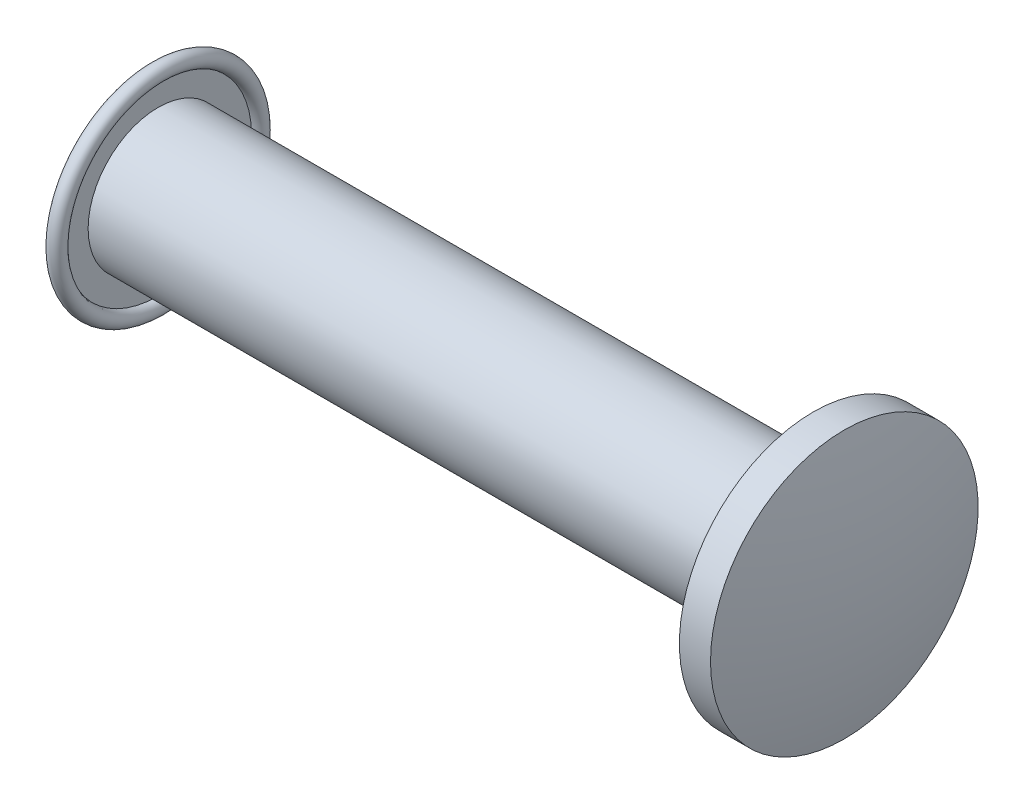
ISO-10303-21;
HEADER;
FILE_DESCRIPTION(('STEP AP214'),'2;1');
FILE_NAME('part.step','',(''),(''),'','','');
FILE_SCHEMA(('AUTOMOTIVE_DESIGN { 1 0 10303 214 1 1 1 1 }'));
ENDSEC;
DATA;
#1=APPLICATION_CONTEXT('core data for automotive mechanical design processes');
#2=APPLICATION_PROTOCOL_DEFINITION('international standard','automotive_design',2000,#1);
#3=PRODUCT_CONTEXT('',#1,'mechanical');
#4=PRODUCT('Part','Part','',(#3));
#5=PRODUCT_RELATED_PRODUCT_CATEGORY('part','',(#4));
#6=PRODUCT_DEFINITION_FORMATION('','',#4);
#7=PRODUCT_DEFINITION_CONTEXT('part definition',#1,'design');
#8=PRODUCT_DEFINITION('design','',#6,#7);
#9=PRODUCT_DEFINITION_SHAPE('','',#8);
#10=(LENGTH_UNIT() NAMED_UNIT(*) SI_UNIT(.MILLI.,.METRE.));
#11=(NAMED_UNIT(*) PLANE_ANGLE_UNIT() SI_UNIT($,.RADIAN.));
#12=(NAMED_UNIT(*) SI_UNIT($,.STERADIAN.) SOLID_ANGLE_UNIT());
#13=UNCERTAINTY_MEASURE_WITH_UNIT(LENGTH_MEASURE(1.E-05),#10,'distance_accuracy_value','');
#14=(GEOMETRIC_REPRESENTATION_CONTEXT(3) GLOBAL_UNCERTAINTY_ASSIGNED_CONTEXT((#13)) GLOBAL_UNIT_ASSIGNED_CONTEXT((#10,
#11,#12)) REPRESENTATION_CONTEXT('',''));
#15=CARTESIAN_POINT('',(0.,0.,0.));
#16=DIRECTION('',(0.,0.,1.));
#17=DIRECTION('',(1.,0.,0.));
#18=AXIS2_PLACEMENT_3D('',#15,#16,#17);
#19=CARTESIAN_POINT('',(-10.15,0.,0.));
#20=DIRECTION('',(-1.,0.,0.));
#21=DIRECTION('',(0.,0.,1.));
#22=AXIS2_PLACEMENT_3D('',#19,#20,#21);
#23=TOROIDAL_SURFACE('',#22,3.25,0.25);
#24=CARTESIAN_POINT('',(-10.4,0.,0.));
#25=DIRECTION('',(-1.,0.,0.));
#26=DIRECTION('',(0.,0.,1.));
#27=AXIS2_PLACEMENT_3D('',#24,#25,#26);
#28=CIRCLE('',#27,3.25);
#29=CARTESIAN_POINT('',(-10.4,-3.25,0.));
#30=VERTEX_POINT('',#29);
#31=CARTESIAN_POINT('',(-10.4,0.,-3.25));
#32=VERTEX_POINT('',#31);
#33=EDGE_CURVE('E83',#30,#32,#28,.T.);
#34=ORIENTED_EDGE('',*,*,#33,.F.);
#35=CARTESIAN_POINT('',(-10.4,0.,0.));
#36=DIRECTION('',(-1.,0.,0.));
#37=DIRECTION('',(0.,0.,1.));
#38=AXIS2_PLACEMENT_3D('',#35,#36,#37);
#39=CIRCLE('',#38,3.25);
#40=EDGE_CURVE('E24',#32,#30,#39,.T.);
#41=ORIENTED_EDGE('',*,*,#40,.F.);
#42=CARTESIAN_POINT('',(-10.15,0.,-3.25));
#43=DIRECTION('',(0.,-1.,0.));
#44=DIRECTION('',(0.,0.,-1.));
#45=AXIS2_PLACEMENT_3D('',#42,#43,#44);
#46=CIRCLE('',#45,0.25);
#47=CARTESIAN_POINT('',(-10.15,0.,-3.));
#48=VERTEX_POINT('',#47);
#49=EDGE_CURVE('E11',#32,#48,#46,.T.);
#50=ORIENTED_EDGE('',*,*,#49,.T.);
#51=CARTESIAN_POINT('',(-10.15,0.,0.));
#52=DIRECTION('',(-1.,0.,0.));
#53=DIRECTION('',(0.,0.,1.));
#54=AXIS2_PLACEMENT_3D('',#51,#52,#53);
#55=CIRCLE('',#54,3.);
#56=CARTESIAN_POINT('',(-10.15,-3.,0.));
#57=VERTEX_POINT('',#56);
#58=EDGE_CURVE('E78',#48,#57,#55,.T.);
#59=ORIENTED_EDGE('',*,*,#58,.T.);
#60=CARTESIAN_POINT('',(-10.15,0.,0.));
#61=DIRECTION('',(-1.,0.,0.));
#62=DIRECTION('',(0.,0.,1.));
#63=AXIS2_PLACEMENT_3D('',#60,#61,#62);
#64=CIRCLE('',#63,3.);
#65=EDGE_CURVE('E80',#57,#48,#64,.T.);
#66=ORIENTED_EDGE('',*,*,#65,.T.);
#67=ORIENTED_EDGE('',*,*,#49,.F.);
#68=EDGE_LOOP('',(#34,#41,#50,#59,#66,#67));
#69=FACE_BOUND('',#68,.T.);
#70=ADVANCED_FACE('F16',(#69),#23,.T.);
#71=CARTESIAN_POINT('',(-10.4,-2.25,0.));
#72=DIRECTION('',(-1.,0.,0.));
#73=DIRECTION('',(0.,1.,0.));
#74=AXIS2_PLACEMENT_3D('',#71,#72,#73);
#75=PLANE('',#74);
#76=CARTESIAN_POINT('',(-10.4,0.,0.));
#77=DIRECTION('',(1.,0.,0.));
#78=DIRECTION('',(0.,-1.,0.));
#79=AXIS2_PLACEMENT_3D('',#76,#77,#78);
#80=CIRCLE('',#79,1.5);
#81=CARTESIAN_POINT('',(-10.4,-1.5,0.));
#82=VERTEX_POINT('',#81);
#83=CARTESIAN_POINT('',(-10.4,1.5,0.));
#84=VERTEX_POINT('',#83);
#85=EDGE_CURVE('E137',#82,#84,#80,.T.);
#86=ORIENTED_EDGE('',*,*,#85,.T.);
#87=CARTESIAN_POINT('',(-10.4,0.,0.));
#88=DIRECTION('',(1.,0.,0.));
#89=DIRECTION('',(0.,-1.,0.));
#90=AXIS2_PLACEMENT_3D('',#87,#88,#89);
#91=CIRCLE('',#90,1.5);
#92=EDGE_CURVE('E133',#84,#82,#91,.T.);
#93=ORIENTED_EDGE('',*,*,#92,.T.);
#94=EDGE_LOOP('',(#86,#93));
#95=FACE_BOUND('',#94,.T.);
#96=ORIENTED_EDGE('',*,*,#33,.T.);
#97=ORIENTED_EDGE('',*,*,#40,.T.);
#98=EDGE_LOOP('',(#96,#97));
#99=FACE_BOUND('',#98,.T.);
#100=ADVANCED_FACE('F214',(#95,#99),#75,.T.);
#101=CARTESIAN_POINT('',(-10.15,-3.,0.));
#102=DIRECTION('',(1.,0.,0.));
#103=DIRECTION('',(0.,1.,0.));
#104=AXIS2_PLACEMENT_3D('',#101,#102,#103);
#105=PLANE('',#104);
#106=CARTESIAN_POINT('',(-10.15,0.,0.));
#107=DIRECTION('',(-1.,0.,0.));
#108=DIRECTION('',(0.,0.,1.));
#109=AXIS2_PLACEMENT_3D('',#106,#107,#108);
#110=CIRCLE('',#109,2.25);
#111=CARTESIAN_POINT('',(-10.15,-2.25,0.));
#112=VERTEX_POINT('',#111);
#113=CARTESIAN_POINT('',(-10.15,2.25,0.));
#114=VERTEX_POINT('',#113);
#115=EDGE_CURVE('E122',#112,#114,#110,.T.);
#116=ORIENTED_EDGE('',*,*,#115,.T.);
#117=CARTESIAN_POINT('',(-10.15,0.,0.));
#118=DIRECTION('',(-1.,0.,0.));
#119=DIRECTION('',(0.,0.,1.));
#120=AXIS2_PLACEMENT_3D('',#117,#118,#119);
#121=CIRCLE('',#120,2.25);
#122=EDGE_CURVE('E114',#114,#112,#121,.T.);
#123=ORIENTED_EDGE('',*,*,#122,.T.);
#124=EDGE_LOOP('',(#116,#123));
#125=FACE_BOUND('',#124,.T.);
#126=ORIENTED_EDGE('',*,*,#65,.F.);
#127=ORIENTED_EDGE('',*,*,#58,.F.);
#128=EDGE_LOOP('',(#126,#127));
#129=FACE_BOUND('',#128,.T.);
#130=ADVANCED_FACE('F84',(#125,#129),#105,.T.);
#131=CARTESIAN_POINT('',(10.9,-2.25,0.));
#132=DIRECTION('',(-1.,0.,0.));
#133=DIRECTION('',(0.,1.,0.));
#134=AXIS2_PLACEMENT_3D('',#131,#132,#133);
#135=PLANE('',#134);
#136=CARTESIAN_POINT('',(10.9,0.,0.));
#137=DIRECTION('',(-1.,0.,0.));
#138=DIRECTION('',(0.,0.,1.));
#139=AXIS2_PLACEMENT_3D('',#136,#137,#138);
#140=CIRCLE('',#139,2.25);
#141=CARTESIAN_POINT('',(10.9,-2.25,0.));
#142=VERTEX_POINT('',#141);
#143=CARTESIAN_POINT('',(10.9,2.25,0.));
#144=VERTEX_POINT('',#143);
#145=EDGE_CURVE('E104',#142,#144,#140,.T.);
#146=ORIENTED_EDGE('',*,*,#145,.F.);
#147=CARTESIAN_POINT('',(10.9,0.,0.));
#148=DIRECTION('',(-1.,0.,0.));
#149=DIRECTION('',(0.,0.,1.));
#150=AXIS2_PLACEMENT_3D('',#147,#148,#149);
#151=CIRCLE('',#150,2.25);
#152=EDGE_CURVE('E109',#144,#142,#151,.T.);
#153=ORIENTED_EDGE('',*,*,#152,.F.);
#154=EDGE_LOOP('',(#146,#153));
#155=FACE_BOUND('',#154,.T.);
#156=CARTESIAN_POINT('',(10.9,0.,0.));
#157=DIRECTION('',(-1.,0.,0.));
#158=DIRECTION('',(0.,0.,1.));
#159=AXIS2_PLACEMENT_3D('',#156,#157,#158);
#160=CIRCLE('',#159,4.3);
#161=CARTESIAN_POINT('',(10.9,-4.3,0.));
#162=VERTEX_POINT('',#161);
#163=CARTESIAN_POINT('',(10.9,4.3,0.));
#164=VERTEX_POINT('',#163);
#165=EDGE_CURVE('E93',#162,#164,#160,.T.);
#166=ORIENTED_EDGE('',*,*,#165,.T.);
#167=CARTESIAN_POINT('',(10.9,0.,0.));
#168=DIRECTION('',(-1.,0.,0.));
#169=DIRECTION('',(0.,0.,1.));
#170=AXIS2_PLACEMENT_3D('',#167,#168,#169);
#171=CIRCLE('',#170,4.3);
#172=EDGE_CURVE('E90',#164,#162,#171,.T.);
#173=ORIENTED_EDGE('',*,*,#172,.T.);
#174=EDGE_LOOP('',(#166,#173));
#175=FACE_BOUND('',#174,.T.);
#176=ADVANCED_FACE('F190',(#155,#175),#135,.T.);
#177=CARTESIAN_POINT('',(11.4,0.,0.));
#178=DIRECTION('',(-1.,0.,0.));
#179=DIRECTION('',(0.,-1.,0.));
#180=AXIS2_PLACEMENT_3D('',#177,#178,#179);
#181=CYLINDRICAL_SURFACE('',#180,4.3);
#182=ORIENTED_EDGE('',*,*,#165,.F.);
#183=ORIENTED_EDGE('',*,*,#172,.F.);
#184=DIRECTION('',(1.,0.,0.));
#185=VECTOR('',#184,1.);
#186=CARTESIAN_POINT('',(11.4,4.3,0.));
#187=LINE('',#186,#185);
#188=CARTESIAN_POINT('',(11.9,4.3,0.));
#189=VERTEX_POINT('',#188);
#190=EDGE_CURVE('E86',#164,#189,#187,.T.);
#191=ORIENTED_EDGE('',*,*,#190,.T.);
#192=CARTESIAN_POINT('',(11.9,0.,0.));
#193=DIRECTION('',(-1.,0.,0.));
#194=DIRECTION('',(0.,0.,1.));
#195=AXIS2_PLACEMENT_3D('',#192,#193,#194);
#196=CIRCLE('',#195,4.3);
#197=CARTESIAN_POINT('',(11.9,-4.3,0.));
#198=VERTEX_POINT('',#197);
#199=EDGE_CURVE('E97',#189,#198,#196,.T.);
#200=ORIENTED_EDGE('',*,*,#199,.T.);
#201=CARTESIAN_POINT('',(11.9,0.,0.));
#202=DIRECTION('',(-1.,0.,0.));
#203=DIRECTION('',(0.,0.,1.));
#204=AXIS2_PLACEMENT_3D('',#201,#202,#203);
#205=CIRCLE('',#204,4.3);
#206=EDGE_CURVE('E100',#198,#189,#205,.T.);
#207=ORIENTED_EDGE('',*,*,#206,.T.);
#208=ORIENTED_EDGE('',*,*,#190,.F.);
#209=EDGE_LOOP('',(#182,#183,#191,#200,#207,#208));
#210=FACE_BOUND('',#209,.T.);
#211=ADVANCED_FACE('F193',(#210),#181,.T.);
#212=CARTESIAN_POINT('',(-6.34,0.,0.));
#213=DIRECTION('',(0.,0.,1.));
#214=DIRECTION('',(1.,0.,0.));
#215=AXIS2_PLACEMENT_3D('',#212,#213,#214);
#216=SPHERICAL_SURFACE('',#215,18.74);
#217=CARTESIAN_POINT('',(-6.34,0.,0.));
#218=DIRECTION('',(-1.,0.,0.));
#219=DIRECTION('',(0.,0.,1.));
#220=AXIS2_PLACEMENT_3D('',#217,#218,#219);
#221=SPHERICAL_SURFACE('',#220,18.74);
#222=ORIENTED_EDGE('',*,*,#206,.F.);
#223=ORIENTED_EDGE('',*,*,#199,.F.);
#224=EDGE_LOOP('',(#222,#223));
#225=FACE_BOUND('',#224,.T.);
#226=ADVANCED_FACE('F201',(#225),#221,.T.);
#227=CARTESIAN_POINT('',(-10.275,0.,0.));
#228=DIRECTION('',(-1.,0.,0.));
#229=DIRECTION('',(0.,-1.,0.));
#230=AXIS2_PLACEMENT_3D('',#227,#228,#229);
#231=CYLINDRICAL_SURFACE('',#230,2.25);
#232=ORIENTED_EDGE('',*,*,#115,.F.);
#233=ORIENTED_EDGE('',*,*,#122,.F.);
#234=DIRECTION('',(1.,0.,0.));
#235=VECTOR('',#234,1.);
#236=CARTESIAN_POINT('',(-10.275,2.25,0.));
#237=LINE('',#236,#235);
#238=EDGE_CURVE('E110',#114,#144,#237,.T.);
#239=ORIENTED_EDGE('',*,*,#238,.T.);
#240=ORIENTED_EDGE('',*,*,#152,.T.);
#241=ORIENTED_EDGE('',*,*,#145,.T.);
#242=ORIENTED_EDGE('',*,*,#238,.F.);
#243=EDGE_LOOP('',(#232,#233,#239,#240,#241,#242));
#244=FACE_BOUND('',#243,.T.);
#245=ADVANCED_FACE('F187',(#244),#231,.T.);
#246=CARTESIAN_POINT('',(-7.65,0.,0.));
#247=DIRECTION('',(-1.,0.,0.));
#248=DIRECTION('',(0.,-1.,0.));
#249=AXIS2_PLACEMENT_3D('',#246,#247,#248);
#250=CONICAL_SURFACE('',#249,0.75,0.785398163397448);
#251=DIRECTION('',(-0.707106781186548,0.707106781186547,0.));
#252=VECTOR('',#251,1.);
#253=CARTESIAN_POINT('',(-7.65,0.75,0.));
#254=LINE('',#253,#252);
#255=CARTESIAN_POINT('',(-6.9,0.,0.));
#256=VERTEX_POINT('',#255);
#257=CARTESIAN_POINT('',(-8.4,1.5,0.));
#258=VERTEX_POINT('',#257);
#259=EDGE_CURVE('E126',#256,#258,#254,.T.);
#260=ORIENTED_EDGE('',*,*,#259,.T.);
#261=CARTESIAN_POINT('',(-8.4,0.,0.));
#262=DIRECTION('',(-1.,0.,0.));
#263=DIRECTION('',(0.,0.,1.));
#264=AXIS2_PLACEMENT_3D('',#261,#262,#263);
#265=CIRCLE('',#264,1.5);
#266=CARTESIAN_POINT('',(-8.4,-1.5,0.));
#267=VERTEX_POINT('',#266);
#268=EDGE_CURVE('E145',#258,#267,#265,.T.);
#269=ORIENTED_EDGE('',*,*,#268,.T.);
#270=CARTESIAN_POINT('',(-8.4,0.,0.));
#271=DIRECTION('',(-1.,0.,0.));
#272=DIRECTION('',(0.,0.,1.));
#273=AXIS2_PLACEMENT_3D('',#270,#271,#272);
#274=CIRCLE('',#273,1.5);
#275=EDGE_CURVE('E149',#267,#258,#274,.T.);
#276=ORIENTED_EDGE('',*,*,#275,.T.);
#277=ORIENTED_EDGE('',*,*,#259,.F.);
#278=EDGE_LOOP('',(#260,#269,#276,#277));
#279=FACE_BOUND('',#278,.T.);
#280=ADVANCED_FACE('F157',(#279),#250,.F.);
#281=CARTESIAN_POINT('',(-9.4,0.,0.));
#282=DIRECTION('',(-1.,0.,0.));
#283=DIRECTION('',(0.,-1.,0.));
#284=AXIS2_PLACEMENT_3D('',#281,#282,#283);
#285=CYLINDRICAL_SURFACE('',#284,1.5);
#286=ORIENTED_EDGE('',*,*,#275,.F.);
#287=ORIENTED_EDGE('',*,*,#268,.F.);
#288=DIRECTION('',(-1.,0.,0.));
#289=VECTOR('',#288,1.);
#290=CARTESIAN_POINT('',(-9.4,1.5,0.));
#291=LINE('',#290,#289);
#292=EDGE_CURVE('E141',#258,#84,#291,.T.);
#293=ORIENTED_EDGE('',*,*,#292,.T.);
#294=ORIENTED_EDGE('',*,*,#85,.F.);
#295=ORIENTED_EDGE('',*,*,#92,.F.);
#296=ORIENTED_EDGE('',*,*,#292,.F.);
#297=EDGE_LOOP('',(#286,#287,#293,#294,#295,#296));
#298=FACE_BOUND('',#297,.T.);
#299=ADVANCED_FACE('F166',(#298),#285,.F.);
#300=CLOSED_SHELL('',(#70,#100,#130,#176,#211,#226,#245,#280,#299));
#301=MANIFOLD_SOLID_BREP('B1',#300);
#302=ADVANCED_BREP_SHAPE_REPRESENTATION('',(#18,#301),#14);
#303=SHAPE_DEFINITION_REPRESENTATION(#9,#302);
ENDSEC;
END-ISO-10303-21;
